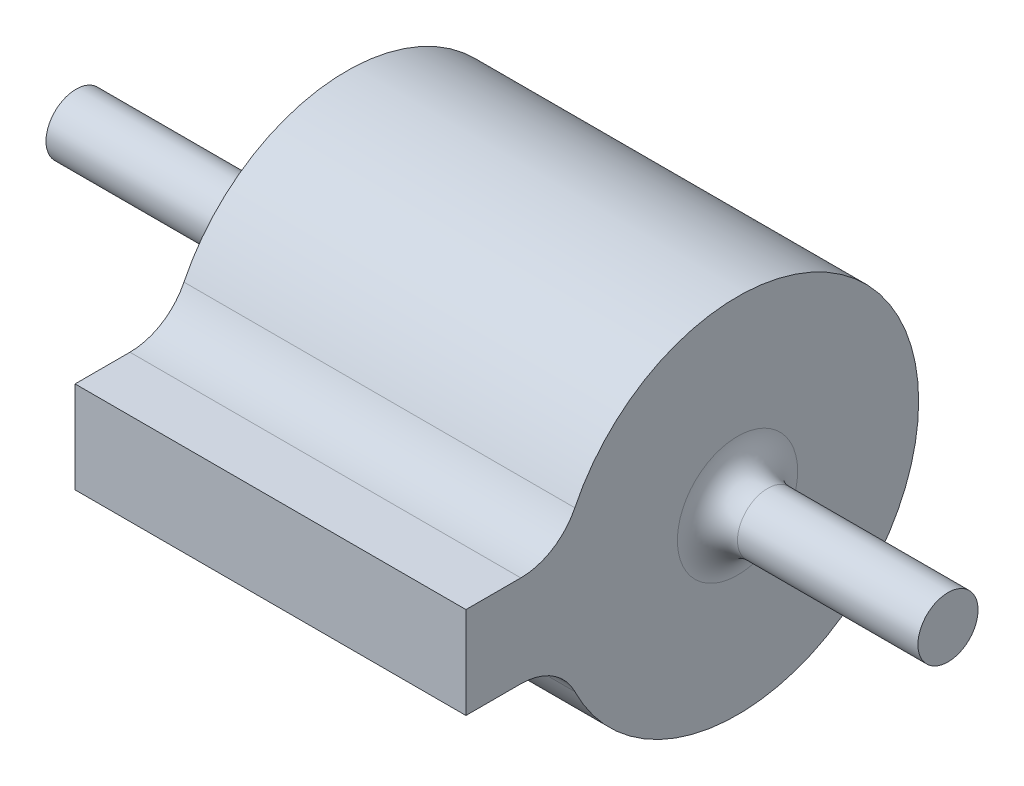
ISO-10303-21;
HEADER;
FILE_DESCRIPTION(('STEP AP214'),'2;1');
FILE_NAME('part.step','',(''),(''),'','','');
FILE_SCHEMA(('AUTOMOTIVE_DESIGN { 1 0 10303 214 1 1 1 1 }'));
ENDSEC;
DATA;
#1=APPLICATION_CONTEXT('core data for automotive mechanical design processes');
#2=APPLICATION_PROTOCOL_DEFINITION('international standard','automotive_design',2000,#1);
#3=PRODUCT_CONTEXT('',#1,'mechanical');
#4=PRODUCT('Part','Part','',(#3));
#5=PRODUCT_RELATED_PRODUCT_CATEGORY('part','',(#4));
#6=PRODUCT_DEFINITION_FORMATION('','',#4);
#7=PRODUCT_DEFINITION_CONTEXT('part definition',#1,'design');
#8=PRODUCT_DEFINITION('design','',#6,#7);
#9=PRODUCT_DEFINITION_SHAPE('','',#8);
#10=(LENGTH_UNIT() NAMED_UNIT(*) SI_UNIT(.MILLI.,.METRE.));
#11=(NAMED_UNIT(*) PLANE_ANGLE_UNIT() SI_UNIT($,.RADIAN.));
#12=(NAMED_UNIT(*) SI_UNIT($,.STERADIAN.) SOLID_ANGLE_UNIT());
#13=UNCERTAINTY_MEASURE_WITH_UNIT(LENGTH_MEASURE(1.E-05),#10,'distance_accuracy_value','');
#14=(GEOMETRIC_REPRESENTATION_CONTEXT(3) GLOBAL_UNCERTAINTY_ASSIGNED_CONTEXT((#13)) GLOBAL_UNIT_ASSIGNED_CONTEXT((#10,
#11,#12)) REPRESENTATION_CONTEXT('',''));
#15=CARTESIAN_POINT('',(0.,0.,0.));
#16=DIRECTION('',(0.,0.,1.));
#17=DIRECTION('',(1.,0.,0.));
#18=AXIS2_PLACEMENT_3D('',#15,#16,#17);
#19=CARTESIAN_POINT('',(130.,0.,0.));
#20=DIRECTION('',(1.,0.,0.));
#21=DIRECTION('',(0.,0.,-1.));
#22=AXIS2_PLACEMENT_3D('',#19,#20,#21);
#23=PLANE('',#22);
#24=CARTESIAN_POINT('',(130.,0.,0.));
#25=DIRECTION('',(1.,0.,0.));
#26=DIRECTION('',(0.,0.,-1.));
#27=AXIS2_PLACEMENT_3D('',#24,#25,#26);
#28=CIRCLE('',#27,20.);
#29=CARTESIAN_POINT('',(130.,0.,-20.));
#30=VERTEX_POINT('',#29);
#31=EDGE_CURVE('E11',#30,#30,#28,.F.);
#32=ORIENTED_EDGE('',*,*,#31,.T.);
#33=EDGE_LOOP('',(#32));
#34=FACE_BOUND('',#33,.T.);
#35=DIRECTION('',(0.,0.,-1.));
#36=VECTOR('',#35,1.);
#37=CARTESIAN_POINT('',(130.,-15.2605617711092,90.3313798384014));
#38=LINE('',#37,#36);
#39=CARTESIAN_POINT('',(130.,-15.2605617711092,90.3313798384014));
#40=VERTEX_POINT('',#39);
#41=CARTESIAN_POINT('',(130.,-15.2605617711092,72.0805300631987));
#42=VERTEX_POINT('',#41);
#43=EDGE_CURVE('E110',#40,#42,#38,.T.);
#44=ORIENTED_EDGE('',*,*,#43,.T.);
#45=CARTESIAN_POINT('',(130.,-35.2605617711092,72.0805300631987));
#46=DIRECTION('',(1.,0.,0.));
#47=DIRECTION('',(0.,0.,-1.));
#48=AXIS2_PLACEMENT_3D('',#45,#46,#47);
#49=CIRCLE('',#48,20.);
#50=CARTESIAN_POINT('',(130.,-26.4720964281285,54.1149274594665));
#51=VERTEX_POINT('',#50);
#52=EDGE_CURVE('E136',#42,#51,#49,.F.);
#53=ORIENTED_EDGE('',*,*,#52,.T.);
#54=CARTESIAN_POINT('',(130.,0.,0.));
#55=DIRECTION('',(1.,0.,0.));
#56=DIRECTION('',(0.,0.,-1.));
#57=AXIS2_PLACEMENT_3D('',#54,#55,#56);
#58=CIRCLE('',#57,60.2428191840609);
#59=CARTESIAN_POINT('',(130.,26.4720964281285,54.1149274594665));
#60=VERTEX_POINT('',#59);
#61=EDGE_CURVE('E95',#51,#60,#58,.T.);
#62=ORIENTED_EDGE('',*,*,#61,.T.);
#63=CARTESIAN_POINT('',(130.,35.2605617711092,72.0805300631987));
#64=DIRECTION('',(1.,0.,0.));
#65=DIRECTION('',(0.,0.,-1.));
#66=AXIS2_PLACEMENT_3D('',#63,#64,#65);
#67=CIRCLE('',#66,20.);
#68=CARTESIAN_POINT('',(130.,15.2605617711092,72.0805300631987));
#69=VERTEX_POINT('',#68);
#70=EDGE_CURVE('E51',#60,#69,#67,.F.);
#71=ORIENTED_EDGE('',*,*,#70,.T.);
#72=DIRECTION('',(0.,0.,1.));
#73=VECTOR('',#72,1.);
#74=CARTESIAN_POINT('',(130.,15.2605617711092,58.2778904703458));
#75=LINE('',#74,#73);
#76=CARTESIAN_POINT('',(130.,15.2605617711092,90.3313798384014));
#77=VERTEX_POINT('',#76);
#78=EDGE_CURVE('E88',#69,#77,#75,.T.);
#79=ORIENTED_EDGE('',*,*,#78,.T.);
#80=DIRECTION('',(0.,-1.,0.));
#81=VECTOR('',#80,1.);
#82=CARTESIAN_POINT('',(130.,15.2605617711092,90.3313798384014));
#83=LINE('',#82,#81);
#84=EDGE_CURVE('E92',#77,#40,#83,.T.);
#85=ORIENTED_EDGE('',*,*,#84,.T.);
#86=EDGE_LOOP('',(#44,#53,#62,#71,#79,#85));
#87=FACE_BOUND('',#86,.T.);
#88=ADVANCED_FACE('F36',(#34,#87),#23,.T.);
#89=CARTESIAN_POINT('',(0.,0.,0.));
#90=DIRECTION('',(1.,0.,0.));
#91=DIRECTION('',(0.,0.,-1.));
#92=AXIS2_PLACEMENT_3D('',#89,#90,#91);
#93=PLANE('',#92);
#94=CARTESIAN_POINT('',(0.,0.,0.));
#95=DIRECTION('',(1.,0.,0.));
#96=DIRECTION('',(0.,0.,-1.));
#97=AXIS2_PLACEMENT_3D('',#94,#95,#96);
#98=CIRCLE('',#97,20.);
#99=CARTESIAN_POINT('',(0.,0.,-20.));
#100=VERTEX_POINT('',#99);
#101=EDGE_CURVE('E140',#100,#100,#98,.T.);
#102=ORIENTED_EDGE('',*,*,#101,.T.);
#103=EDGE_LOOP('',(#102));
#104=FACE_BOUND('',#103,.T.);
#105=CARTESIAN_POINT('',(0.,0.,0.));
#106=DIRECTION('',(1.,0.,0.));
#107=DIRECTION('',(0.,0.,-1.));
#108=AXIS2_PLACEMENT_3D('',#105,#106,#107);
#109=CIRCLE('',#108,60.2428191840609);
#110=CARTESIAN_POINT('',(0.,-26.4720964281285,54.1149274594665));
#111=VERTEX_POINT('',#110);
#112=CARTESIAN_POINT('',(0.,26.4720964281285,54.1149274594665));
#113=VERTEX_POINT('',#112);
#114=EDGE_CURVE('E115',#111,#113,#109,.T.);
#115=ORIENTED_EDGE('',*,*,#114,.F.);
#116=CARTESIAN_POINT('',(0.,-35.2605617711092,72.0805300631987));
#117=DIRECTION('',(1.,0.,0.));
#118=DIRECTION('',(0.,0.,-1.));
#119=AXIS2_PLACEMENT_3D('',#116,#117,#118);
#120=CIRCLE('',#119,20.);
#121=CARTESIAN_POINT('',(0.,-15.2605617711092,72.0805300631987));
#122=VERTEX_POINT('',#121);
#123=EDGE_CURVE('E134',#111,#122,#120,.T.);
#124=ORIENTED_EDGE('',*,*,#123,.T.);
#125=DIRECTION('',(0.,0.,-1.));
#126=VECTOR('',#125,1.);
#127=CARTESIAN_POINT('',(0.,-15.2605617711092,90.3313798384014));
#128=LINE('',#127,#126);
#129=CARTESIAN_POINT('',(0.,-15.2605617711092,90.3313798384014));
#130=VERTEX_POINT('',#129);
#131=EDGE_CURVE('E122',#130,#122,#128,.T.);
#132=ORIENTED_EDGE('',*,*,#131,.F.);
#133=DIRECTION('',(0.,-1.,0.));
#134=VECTOR('',#133,1.);
#135=CARTESIAN_POINT('',(0.,15.2605617711092,90.3313798384014));
#136=LINE('',#135,#134);
#137=CARTESIAN_POINT('',(0.,15.2605617711092,90.3313798384014));
#138=VERTEX_POINT('',#137);
#139=EDGE_CURVE('E120',#138,#130,#136,.T.);
#140=ORIENTED_EDGE('',*,*,#139,.F.);
#141=DIRECTION('',(0.,0.,1.));
#142=VECTOR('',#141,1.);
#143=CARTESIAN_POINT('',(0.,15.2605617711092,58.2778904703458));
#144=LINE('',#143,#142);
#145=CARTESIAN_POINT('',(0.,15.2605617711092,72.0805300631987));
#146=VERTEX_POINT('',#145);
#147=EDGE_CURVE('E101',#146,#138,#144,.T.);
#148=ORIENTED_EDGE('',*,*,#147,.F.);
#149=CARTESIAN_POINT('',(0.,35.2605617711092,72.0805300631987));
#150=DIRECTION('',(1.,0.,0.));
#151=DIRECTION('',(0.,0.,-1.));
#152=AXIS2_PLACEMENT_3D('',#149,#150,#151);
#153=CIRCLE('',#152,20.);
#154=EDGE_CURVE('E59',#146,#113,#153,.T.);
#155=ORIENTED_EDGE('',*,*,#154,.T.);
#156=EDGE_LOOP('',(#115,#124,#132,#140,#148,#155));
#157=FACE_BOUND('',#156,.T.);
#158=ADVANCED_FACE('F161',(#104,#157),#93,.F.);
#159=CARTESIAN_POINT('',(130.,0.,0.));
#160=DIRECTION('',(-1.,0.,0.));
#161=DIRECTION('',(0.,0.,1.));
#162=AXIS2_PLACEMENT_3D('',#159,#160,#161);
#163=CYLINDRICAL_SURFACE('',#162,60.2428191840609);
#164=ORIENTED_EDGE('',*,*,#61,.F.);
#165=DIRECTION('',(-1.,0.,0.));
#166=VECTOR('',#165,1.);
#167=CARTESIAN_POINT('',(130.,-26.4720964281285,54.1149274594665));
#168=LINE('',#167,#166);
#169=EDGE_CURVE('E127',#51,#111,#168,.T.);
#170=ORIENTED_EDGE('',*,*,#169,.T.);
#171=ORIENTED_EDGE('',*,*,#114,.T.);
#172=DIRECTION('',(-1.,0.,0.));
#173=VECTOR('',#172,1.);
#174=CARTESIAN_POINT('',(130.,26.4720964281285,54.1149274594665));
#175=LINE('',#174,#173);
#176=EDGE_CURVE('E104',#113,#60,#175,.F.);
#177=ORIENTED_EDGE('',*,*,#176,.T.);
#178=EDGE_LOOP('',(#164,#170,#171,#177));
#179=FACE_BOUND('',#178,.T.);
#180=ADVANCED_FACE('F167',(#179),#163,.T.);
#181=CARTESIAN_POINT('',(130.,15.2605617711092,58.2778904703458));
#182=DIRECTION('',(0.,-1.,0.));
#183=DIRECTION('',(0.,0.,-1.));
#184=AXIS2_PLACEMENT_3D('',#181,#182,#183);
#185=PLANE('',#184);
#186=ORIENTED_EDGE('',*,*,#78,.F.);
#187=DIRECTION('',(1.,0.,0.));
#188=VECTOR('',#187,1.);
#189=CARTESIAN_POINT('',(0.,15.2605617711092,72.0805300631987));
#190=LINE('',#189,#188);
#191=EDGE_CURVE('E132',#69,#146,#190,.F.);
#192=ORIENTED_EDGE('',*,*,#191,.T.);
#193=ORIENTED_EDGE('',*,*,#147,.T.);
#194=DIRECTION('',(-1.,0.,0.));
#195=VECTOR('',#194,1.);
#196=CARTESIAN_POINT('',(130.,15.2605617711092,90.3313798384014));
#197=LINE('',#196,#195);
#198=EDGE_CURVE('E98',#77,#138,#197,.T.);
#199=ORIENTED_EDGE('',*,*,#198,.F.);
#200=EDGE_LOOP('',(#186,#192,#193,#199));
#201=FACE_BOUND('',#200,.T.);
#202=ADVANCED_FACE('F99',(#201),#185,.F.);
#203=CARTESIAN_POINT('',(130.,15.2605617711092,90.3313798384014));
#204=DIRECTION('',(0.,0.,-1.));
#205=DIRECTION('',(-1.,0.,0.));
#206=AXIS2_PLACEMENT_3D('',#203,#204,#205);
#207=PLANE('',#206);
#208=ORIENTED_EDGE('',*,*,#139,.T.);
#209=DIRECTION('',(-1.,0.,0.));
#210=VECTOR('',#209,1.);
#211=CARTESIAN_POINT('',(130.,-15.2605617711092,90.3313798384014));
#212=LINE('',#211,#210);
#213=EDGE_CURVE('E105',#40,#130,#212,.T.);
#214=ORIENTED_EDGE('',*,*,#213,.F.);
#215=ORIENTED_EDGE('',*,*,#84,.F.);
#216=ORIENTED_EDGE('',*,*,#198,.T.);
#217=EDGE_LOOP('',(#208,#214,#215,#216));
#218=FACE_BOUND('',#217,.T.);
#219=ADVANCED_FACE('F107',(#218),#207,.F.);
#220=CARTESIAN_POINT('',(130.,-15.2605617711092,90.3313798384014));
#221=DIRECTION('',(0.,1.,0.));
#222=DIRECTION('',(0.,0.,1.));
#223=AXIS2_PLACEMENT_3D('',#220,#221,#222);
#224=PLANE('',#223);
#225=ORIENTED_EDGE('',*,*,#131,.T.);
#226=DIRECTION('',(1.,0.,0.));
#227=VECTOR('',#226,1.);
#228=CARTESIAN_POINT('',(130.,-15.2605617711092,72.0805300631987));
#229=LINE('',#228,#227);
#230=EDGE_CURVE('E130',#122,#42,#229,.T.);
#231=ORIENTED_EDGE('',*,*,#230,.T.);
#232=ORIENTED_EDGE('',*,*,#43,.F.);
#233=ORIENTED_EDGE('',*,*,#213,.T.);
#234=EDGE_LOOP('',(#225,#231,#232,#233));
#235=FACE_BOUND('',#234,.T.);
#236=ADVANCED_FACE('F173',(#235),#224,.F.);
#237=CARTESIAN_POINT('',(130.,-35.2605617711092,72.0805300631987));
#238=DIRECTION('',(-1.,0.,0.));
#239=DIRECTION('',(0.,0.,1.));
#240=AXIS2_PLACEMENT_3D('',#237,#238,#239);
#241=CYLINDRICAL_SURFACE('',#240,20.);
#242=ORIENTED_EDGE('',*,*,#52,.F.);
#243=ORIENTED_EDGE('',*,*,#230,.F.);
#244=ORIENTED_EDGE('',*,*,#123,.F.);
#245=ORIENTED_EDGE('',*,*,#169,.F.);
#246=EDGE_LOOP('',(#242,#243,#244,#245));
#247=FACE_BOUND('',#246,.T.);
#248=ADVANCED_FACE('F176',(#247),#241,.F.);
#249=CARTESIAN_POINT('',(130.,35.2605617711092,72.0805300631987));
#250=DIRECTION('',(-1.,0.,0.));
#251=DIRECTION('',(0.,0.,1.));
#252=AXIS2_PLACEMENT_3D('',#249,#250,#251);
#253=CYLINDRICAL_SURFACE('',#252,20.);
#254=ORIENTED_EDGE('',*,*,#70,.F.);
#255=ORIENTED_EDGE('',*,*,#176,.F.);
#256=ORIENTED_EDGE('',*,*,#154,.F.);
#257=ORIENTED_EDGE('',*,*,#191,.F.);
#258=EDGE_LOOP('',(#254,#255,#256,#257));
#259=FACE_BOUND('',#258,.T.);
#260=ADVANCED_FACE('F187',(#259),#253,.F.);
#261=CARTESIAN_POINT('',(-90.,0.,0.));
#262=DIRECTION('',(-1.,0.,0.));
#263=DIRECTION('',(0.,0.,1.));
#264=AXIS2_PLACEMENT_3D('',#261,#262,#263);
#265=PLANE('',#264);
#266=CARTESIAN_POINT('',(-90.,0.,0.));
#267=DIRECTION('',(-1.,0.,0.));
#268=DIRECTION('',(0.,0.,1.));
#269=AXIS2_PLACEMENT_3D('',#266,#267,#268);
#270=CIRCLE('',#269,10.);
#271=CARTESIAN_POINT('',(-90.,0.,10.));
#272=VERTEX_POINT('',#271);
#273=EDGE_CURVE('E207',#272,#272,#270,.T.);
#274=ORIENTED_EDGE('',*,*,#273,.T.);
#275=EDGE_LOOP('',(#274));
#276=FACE_BOUND('',#275,.T.);
#277=ADVANCED_FACE('F190',(#276),#265,.T.);
#278=CARTESIAN_POINT('',(200.,0.,0.));
#279=DIRECTION('',(-1.,0.,0.));
#280=DIRECTION('',(0.,0.,1.));
#281=AXIS2_PLACEMENT_3D('',#278,#279,#280);
#282=CYLINDRICAL_SURFACE('',#281,10.);
#283=CARTESIAN_POINT('',(-10.,0.,0.));
#284=DIRECTION('',(1.,0.,0.));
#285=DIRECTION('',(0.,0.,-1.));
#286=AXIS2_PLACEMENT_3D('',#283,#284,#285);
#287=CIRCLE('',#286,10.);
#288=CARTESIAN_POINT('',(-10.,0.,-10.));
#289=VERTEX_POINT('',#288);
#290=EDGE_CURVE('E143',#289,#289,#287,.F.);
#291=ORIENTED_EDGE('',*,*,#290,.T.);
#292=EDGE_LOOP('',(#291));
#293=FACE_BOUND('',#292,.T.);
#294=ORIENTED_EDGE('',*,*,#273,.F.);
#295=EDGE_LOOP('',(#294));
#296=FACE_BOUND('',#295,.T.);
#297=ADVANCED_FACE('F194',(#293,#296),#282,.T.);
#298=CARTESIAN_POINT('',(140.,0.,0.));
#299=DIRECTION('',(1.,0.,0.));
#300=DIRECTION('',(0.,0.,-1.));
#301=AXIS2_PLACEMENT_3D('',#298,#299,#300);
#302=CIRCLE('',#301,10.);
#303=CARTESIAN_POINT('',(140.,0.,-10.));
#304=VERTEX_POINT('',#303);
#305=EDGE_CURVE('E44',#304,#304,#302,.T.);
#306=ORIENTED_EDGE('',*,*,#305,.T.);
#307=EDGE_LOOP('',(#306));
#308=FACE_BOUND('',#307,.T.);
#309=CARTESIAN_POINT('',(200.,0.,0.));
#310=DIRECTION('',(-1.,0.,0.));
#311=DIRECTION('',(0.,0.,1.));
#312=AXIS2_PLACEMENT_3D('',#309,#310,#311);
#313=CIRCLE('',#312,10.);
#314=CARTESIAN_POINT('',(200.,0.,10.));
#315=VERTEX_POINT('',#314);
#316=EDGE_CURVE('E118',#315,#315,#313,.T.);
#317=ORIENTED_EDGE('',*,*,#316,.T.);
#318=EDGE_LOOP('',(#317));
#319=FACE_BOUND('',#318,.T.);
#320=ADVANCED_FACE('F148',(#308,#319),#282,.T.);
#321=CARTESIAN_POINT('',(200.,0.,0.));
#322=DIRECTION('',(-1.,0.,0.));
#323=DIRECTION('',(0.,0.,1.));
#324=AXIS2_PLACEMENT_3D('',#321,#322,#323);
#325=PLANE('',#324);
#326=ORIENTED_EDGE('',*,*,#316,.F.);
#327=EDGE_LOOP('',(#326));
#328=FACE_BOUND('',#327,.T.);
#329=ADVANCED_FACE('F157',(#328),#325,.F.);
#330=CARTESIAN_POINT('',(-10.,0.,0.));
#331=DIRECTION('',(1.,0.,0.));
#332=DIRECTION('',(0.,0.,-1.));
#333=AXIS2_PLACEMENT_3D('',#330,#331,#332);
#334=TOROIDAL_SURFACE('',#333,20.,10.);
#335=ORIENTED_EDGE('',*,*,#290,.F.);
#336=EDGE_LOOP('',(#335));
#337=FACE_BOUND('',#336,.T.);
#338=ORIENTED_EDGE('',*,*,#101,.F.);
#339=EDGE_LOOP('',(#338));
#340=FACE_BOUND('',#339,.T.);
#341=ADVANCED_FACE('F152',(#337,#340),#334,.F.);
#342=CARTESIAN_POINT('',(140.,0.,0.));
#343=DIRECTION('',(1.,0.,0.));
#344=DIRECTION('',(0.,0.,-1.));
#345=AXIS2_PLACEMENT_3D('',#342,#343,#344);
#346=TOROIDAL_SURFACE('',#345,20.,10.);
#347=ORIENTED_EDGE('',*,*,#31,.F.);
#348=EDGE_LOOP('',(#347));
#349=FACE_BOUND('',#348,.T.);
#350=ORIENTED_EDGE('',*,*,#305,.F.);
#351=EDGE_LOOP('',(#350));
#352=FACE_BOUND('',#351,.T.);
#353=ADVANCED_FACE('F38',(#349,#352),#346,.F.);
#354=CLOSED_SHELL('',(#88,#158,#180,#202,#219,#236,#248,#260,#277,#297,#320,#329,#341,#353));
#355=MANIFOLD_SOLID_BREP('B2',#354);
#356=ADVANCED_BREP_SHAPE_REPRESENTATION('',(#18,#355),#14);
#357=SHAPE_DEFINITION_REPRESENTATION(#9,#356);
ENDSEC;
END-ISO-10303-21;
